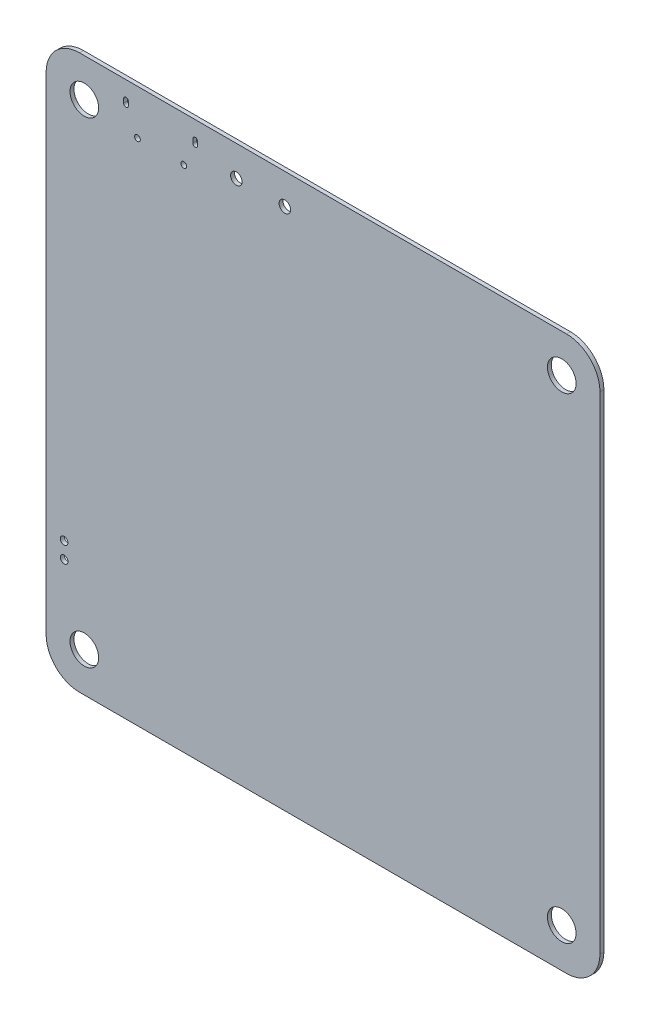
ISO-10303-21;
HEADER;
FILE_DESCRIPTION(('STEP AP214'),'2;1');
FILE_NAME('part.step','',(''),(''),'','','');
FILE_SCHEMA(('AUTOMOTIVE_DESIGN { 1 0 10303 214 1 1 1 1 }'));
ENDSEC;
DATA;
#1=APPLICATION_CONTEXT('core data for automotive mechanical design processes');
#2=APPLICATION_PROTOCOL_DEFINITION('international standard','automotive_design',2000,#1);
#3=PRODUCT_CONTEXT('',#1,'mechanical');
#4=PRODUCT('Part','Part','',(#3));
#5=PRODUCT_RELATED_PRODUCT_CATEGORY('part','',(#4));
#6=PRODUCT_DEFINITION_FORMATION('','',#4);
#7=PRODUCT_DEFINITION_CONTEXT('part definition',#1,'design');
#8=PRODUCT_DEFINITION('design','',#6,#7);
#9=PRODUCT_DEFINITION_SHAPE('','',#8);
#10=(LENGTH_UNIT() NAMED_UNIT(*) SI_UNIT(.MILLI.,.METRE.));
#11=(NAMED_UNIT(*) PLANE_ANGLE_UNIT() SI_UNIT($,.RADIAN.));
#12=(NAMED_UNIT(*) SI_UNIT($,.STERADIAN.) SOLID_ANGLE_UNIT());
#13=UNCERTAINTY_MEASURE_WITH_UNIT(LENGTH_MEASURE(1.E-05),#10,'distance_accuracy_value','');
#14=(GEOMETRIC_REPRESENTATION_CONTEXT(3) GLOBAL_UNCERTAINTY_ASSIGNED_CONTEXT((#13)) GLOBAL_UNIT_ASSIGNED_CONTEXT((#10,
#11,#12)) REPRESENTATION_CONTEXT('',''));
#15=CARTESIAN_POINT('',(0.,0.,0.));
#16=DIRECTION('',(0.,0.,1.));
#17=DIRECTION('',(1.,0.,0.));
#18=AXIS2_PLACEMENT_3D('',#15,#16,#17);
#19=CARTESIAN_POINT('',(152.4200533,92.07949834,0.41148));
#20=DIRECTION('',(0.,0.,-1.));
#21=DIRECTION('',(-1.,0.,0.));
#22=AXIS2_PLACEMENT_3D('',#19,#20,#21);
#23=PLANE('',#22);
#24=CARTESIAN_POINT('',(172.339,143.383,0.41148));
#25=DIRECTION('',(0.,0.,-1.));
#26=DIRECTION('',(-1.,0.,0.));
#27=AXIS2_PLACEMENT_3D('',#24,#25,#26);
#28=CIRCLE('',#27,0.5999988);
#29=CARTESIAN_POINT('',(171.7390012,143.383,0.41148));
#30=VERTEX_POINT('',#29);
#31=EDGE_CURVE('E240',#30,#30,#28,.T.);
#32=ORIENTED_EDGE('',*,*,#31,.T.);
#33=EDGE_LOOP('',(#32));
#34=FACE_BOUND('',#33,.T.);
#35=CARTESIAN_POINT('',(177.419,143.383,0.41148));
#36=DIRECTION('',(0.,0.,-1.));
#37=DIRECTION('',(-1.,0.,0.));
#38=AXIS2_PLACEMENT_3D('',#35,#36,#37);
#39=CIRCLE('',#38,0.5999988);
#40=CARTESIAN_POINT('',(176.8190012,143.383,0.41148));
#41=VERTEX_POINT('',#40);
#42=EDGE_CURVE('E243',#41,#41,#39,.T.);
#43=ORIENTED_EDGE('',*,*,#42,.T.);
#44=EDGE_LOOP('',(#43));
#45=FACE_BOUND('',#44,.T.);
#46=DIRECTION('',(0.,1.,0.));
#47=VECTOR('',#46,1.);
#48=CARTESIAN_POINT('',(167.78199616,144.7259996,0.41148));
#49=LINE('',#48,#47);
#50=CARTESIAN_POINT('',(167.78199616,144.7259996,0.41148));
#51=VERTEX_POINT('',#50);
#52=CARTESIAN_POINT('',(167.78199616,144.3260004,0.41148));
#53=VERTEX_POINT('',#52);
#54=EDGE_CURVE('E157',#51,#53,#49,.F.);
#55=ORIENTED_EDGE('',*,*,#54,.F.);
#56=CARTESIAN_POINT('',(168.03199566,144.7259996,0.41148));
#57=DIRECTION('',(0.,0.,-1.));
#58=DIRECTION('',(-1.,0.,0.));
#59=AXIS2_PLACEMENT_3D('',#56,#57,#58);
#60=CIRCLE('',#59,0.2499995);
#61=CARTESIAN_POINT('',(168.28199516,144.7259996,0.41148));
#62=VERTEX_POINT('',#61);
#63=EDGE_CURVE('E164',#51,#62,#60,.T.);
#64=ORIENTED_EDGE('',*,*,#63,.T.);
#65=DIRECTION('',(0.,1.,0.));
#66=VECTOR('',#65,1.);
#67=CARTESIAN_POINT('',(168.28199516,144.3260004,0.41148));
#68=LINE('',#67,#66);
#69=CARTESIAN_POINT('',(168.28199516,144.3260004,0.41148));
#70=VERTEX_POINT('',#69);
#71=EDGE_CURVE('E161',#70,#62,#68,.T.);
#72=ORIENTED_EDGE('',*,*,#71,.F.);
#73=CARTESIAN_POINT('',(168.03199566,144.3260004,0.41148));
#74=DIRECTION('',(0.,0.,-1.));
#75=DIRECTION('',(-1.,0.,0.));
#76=AXIS2_PLACEMENT_3D('',#73,#74,#75);
#77=CIRCLE('',#76,0.2499995);
#78=EDGE_CURVE('E246',#70,#53,#77,.T.);
#79=ORIENTED_EDGE('',*,*,#78,.T.);
#80=EDGE_LOOP('',(#55,#64,#72,#79));
#81=FACE_BOUND('',#80,.T.);
#82=CARTESIAN_POINT('',(206.42005452,142.57949894,0.41148));
#83=DIRECTION('',(0.,0.,-1.));
#84=DIRECTION('',(-1.,0.,0.));
#85=AXIS2_PLACEMENT_3D('',#82,#83,#84);
#86=CIRCLE('',#85,1.49999954);
#87=CARTESIAN_POINT('',(204.92005498,142.57949894,0.41148));
#88=VERTEX_POINT('',#87);
#89=EDGE_CURVE('E165',#88,#88,#86,.T.);
#90=ORIENTED_EDGE('',*,*,#89,.T.);
#91=EDGE_LOOP('',(#90));
#92=FACE_BOUND('',#91,.T.);
#93=CARTESIAN_POINT('',(206.42005452,92.70903734,0.41148));
#94=DIRECTION('',(0.,0.,-1.));
#95=DIRECTION('',(-1.,0.,0.));
#96=AXIS2_PLACEMENT_3D('',#93,#94,#95);
#97=CIRCLE('',#96,1.49999954);
#98=CARTESIAN_POINT('',(204.92005498,92.70903734,0.41148));
#99=VERTEX_POINT('',#98);
#100=EDGE_CURVE('E252',#99,#99,#97,.T.);
#101=ORIENTED_EDGE('',*,*,#100,.T.);
#102=EDGE_LOOP('',(#101));
#103=FACE_BOUND('',#102,.T.);
#104=CARTESIAN_POINT('',(166.83199552,141.87600022,0.41148));
#105=DIRECTION('',(0.,0.,-1.));
#106=DIRECTION('',(-1.,0.,0.));
#107=AXIS2_PLACEMENT_3D('',#104,#105,#106);
#108=CIRCLE('',#107,0.2999994);
#109=CARTESIAN_POINT('',(166.53199612,141.87600022,0.41148));
#110=VERTEX_POINT('',#109);
#111=EDGE_CURVE('E255',#110,#110,#108,.T.);
#112=ORIENTED_EDGE('',*,*,#111,.T.);
#113=EDGE_LOOP('',(#112));
#114=FACE_BOUND('',#113,.T.);
#115=DIRECTION('',(0.,1.,0.));
#116=VECTOR('',#115,1.);
#117=CARTESIAN_POINT('',(160.53199542,144.7259996,0.41148));
#118=LINE('',#117,#116);
#119=CARTESIAN_POINT('',(160.53199542,144.7259996,0.41148));
#120=VERTEX_POINT('',#119);
#121=CARTESIAN_POINT('',(160.53199542,144.3260004,0.41148));
#122=VERTEX_POINT('',#121);
#123=EDGE_CURVE('E166',#120,#122,#118,.F.);
#124=ORIENTED_EDGE('',*,*,#123,.F.);
#125=CARTESIAN_POINT('',(160.78199492,144.7259996,0.41148));
#126=DIRECTION('',(0.,0.,-1.));
#127=DIRECTION('',(-1.,0.,0.));
#128=AXIS2_PLACEMENT_3D('',#125,#126,#127);
#129=CIRCLE('',#128,0.2499995);
#130=CARTESIAN_POINT('',(161.03199442,144.7259996,0.41148));
#131=VERTEX_POINT('',#130);
#132=EDGE_CURVE('E174',#120,#131,#129,.T.);
#133=ORIENTED_EDGE('',*,*,#132,.T.);
#134=DIRECTION('',(0.,1.,0.));
#135=VECTOR('',#134,1.);
#136=CARTESIAN_POINT('',(161.03199442,144.3260004,0.41148));
#137=LINE('',#136,#135);
#138=CARTESIAN_POINT('',(161.03199442,144.3260004,0.41148));
#139=VERTEX_POINT('',#138);
#140=EDGE_CURVE('E171',#139,#131,#137,.T.);
#141=ORIENTED_EDGE('',*,*,#140,.F.);
#142=CARTESIAN_POINT('',(160.78199492,144.3260004,0.41148));
#143=DIRECTION('',(0.,0.,-1.));
#144=DIRECTION('',(-1.,0.,0.));
#145=AXIS2_PLACEMENT_3D('',#142,#143,#144);
#146=CIRCLE('',#145,0.2499995);
#147=EDGE_CURVE('E259',#139,#122,#146,.T.);
#148=ORIENTED_EDGE('',*,*,#147,.T.);
#149=EDGE_LOOP('',(#124,#133,#141,#148));
#150=FACE_BOUND('',#149,.T.);
#151=CARTESIAN_POINT('',(161.98199506,141.87600022,0.41148));
#152=DIRECTION('',(0.,0.,-1.));
#153=DIRECTION('',(-1.,0.,0.));
#154=AXIS2_PLACEMENT_3D('',#151,#152,#153);
#155=CIRCLE('',#154,0.2999994);
#156=CARTESIAN_POINT('',(161.68199566,141.87600022,0.41148));
#157=VERTEX_POINT('',#156);
#158=EDGE_CURVE('E175',#157,#157,#155,.T.);
#159=ORIENTED_EDGE('',*,*,#158,.T.);
#160=EDGE_LOOP('',(#159));
#161=FACE_BOUND('',#160,.T.);
#162=CARTESIAN_POINT('',(156.42005292,142.57949894,0.41148));
#163=DIRECTION('',(0.,0.,-1.));
#164=DIRECTION('',(-1.,0.,0.));
#165=AXIS2_PLACEMENT_3D('',#162,#163,#164);
#166=CIRCLE('',#165,1.49999954);
#167=CARTESIAN_POINT('',(154.92005338,142.57949894,0.41148));
#168=VERTEX_POINT('',#167);
#169=EDGE_CURVE('E265',#168,#168,#166,.T.);
#170=ORIENTED_EDGE('',*,*,#169,.T.);
#171=EDGE_LOOP('',(#170));
#172=FACE_BOUND('',#171,.T.);
#173=CARTESIAN_POINT('',(154.305,99.822,0.41148));
#174=DIRECTION('',(0.,0.,-1.));
#175=DIRECTION('',(-1.,0.,0.));
#176=AXIS2_PLACEMENT_3D('',#173,#174,#175);
#177=CIRCLE('',#176,0.3999992);
#178=CARTESIAN_POINT('',(153.9050008,99.822,0.41148));
#179=VERTEX_POINT('',#178);
#180=EDGE_CURVE('E268',#179,#179,#177,.T.);
#181=ORIENTED_EDGE('',*,*,#180,.T.);
#182=EDGE_LOOP('',(#181));
#183=FACE_BOUND('',#182,.T.);
#184=CARTESIAN_POINT('',(156.42005292,92.70903734,0.41148));
#185=DIRECTION('',(0.,0.,-1.));
#186=DIRECTION('',(-1.,0.,0.));
#187=AXIS2_PLACEMENT_3D('',#184,#185,#186);
#188=CIRCLE('',#187,1.49999954);
#189=CARTESIAN_POINT('',(154.92005338,92.70903734,0.41148));
#190=VERTEX_POINT('',#189);
#191=EDGE_CURVE('E271',#190,#190,#188,.T.);
#192=ORIENTED_EDGE('',*,*,#191,.T.);
#193=EDGE_LOOP('',(#192));
#194=FACE_BOUND('',#193,.T.);
#195=CARTESIAN_POINT('',(154.305,101.52200168,0.41148));
#196=DIRECTION('',(0.,0.,-1.));
#197=DIRECTION('',(-1.,0.,0.));
#198=AXIS2_PLACEMENT_3D('',#195,#196,#197);
#199=CIRCLE('',#198,0.3999992);
#200=CARTESIAN_POINT('',(153.9050008,101.52200168,0.41148));
#201=VERTEX_POINT('',#200);
#202=EDGE_CURVE('E274',#201,#201,#199,.T.);
#203=ORIENTED_EDGE('',*,*,#202,.T.);
#204=EDGE_LOOP('',(#203));
#205=FACE_BOUND('',#204,.T.);
#206=DIRECTION('',(1.,0.,0.));
#207=VECTOR('',#206,1.);
#208=CARTESIAN_POINT('',(155.92005392,88.57949772,0.41148));
#209=LINE('',#208,#207);
#210=CARTESIAN_POINT('',(155.92005353173,88.5794977199995,0.41148));
#211=VERTEX_POINT('',#210);
#212=CARTESIAN_POINT('',(206.920053908265,88.57949772,0.41148));
#213=VERTEX_POINT('',#212);
#214=EDGE_CURVE('E177',#211,#213,#209,.T.);
#215=ORIENTED_EDGE('',*,*,#214,.T.);
#216=CARTESIAN_POINT('',(206.92005429653,92.079497563468,0.41148));
#217=DIRECTION('',(0.,0.,-1.));
#218=DIRECTION('',(-1.,0.,0.));
#219=AXIS2_PLACEMENT_3D('',#216,#217,#218);
#220=CIRCLE('',#219,3.499999843469);
#221=CARTESIAN_POINT('',(210.420054139999,92.079497951734,0.41148));
#222=VERTEX_POINT('',#221);
#223=EDGE_CURVE('E180',#222,#213,#220,.T.);
#224=ORIENTED_EDGE('',*,*,#223,.F.);
#225=DIRECTION('',(0.,1.,0.));
#226=VECTOR('',#225,1.);
#227=CARTESIAN_POINT('',(210.42005414,92.07949834,0.41148));
#228=LINE('',#227,#226);
#229=CARTESIAN_POINT('',(210.42005414,143.079498328265,0.41148));
#230=VERTEX_POINT('',#229);
#231=EDGE_CURVE('E181',#222,#230,#228,.T.);
#232=ORIENTED_EDGE('',*,*,#231,.T.);
#233=CARTESIAN_POINT('',(206.92005429653,143.07949871653,0.41148));
#234=DIRECTION('',(0.,0.,-1.));
#235=DIRECTION('',(-1.,0.,0.));
#236=AXIS2_PLACEMENT_3D('',#233,#234,#235);
#237=CIRCLE('',#236,3.499999843469);
#238=CARTESIAN_POINT('',(206.920053908265,146.579498559999,0.41148));
#239=VERTEX_POINT('',#238);
#240=EDGE_CURVE('E136',#239,#230,#237,.T.);
#241=ORIENTED_EDGE('',*,*,#240,.F.);
#242=DIRECTION('',(1.,0.,0.));
#243=VECTOR('',#242,1.);
#244=CARTESIAN_POINT('',(206.92005352,146.57949856,0.41148));
#245=LINE('',#244,#243);
#246=CARTESIAN_POINT('',(155.92005353173,146.57949856,0.41148));
#247=VERTEX_POINT('',#246);
#248=EDGE_CURVE('E132',#239,#247,#245,.F.);
#249=ORIENTED_EDGE('',*,*,#248,.T.);
#250=CARTESIAN_POINT('',(155.92005314346,143.07949871653,0.41148));
#251=DIRECTION('',(0.,0.,-1.));
#252=DIRECTION('',(-1.,0.,0.));
#253=AXIS2_PLACEMENT_3D('',#250,#251,#252);
#254=CIRCLE('',#253,3.499999843469);
#255=CARTESIAN_POINT('',(152.420053299995,143.07949871653,0.41148));
#256=VERTEX_POINT('',#255);
#257=EDGE_CURVE('E20',#256,#247,#254,.T.);
#258=ORIENTED_EDGE('',*,*,#257,.F.);
#259=DIRECTION('',(0.,1.,0.));
#260=VECTOR('',#259,1.);
#261=CARTESIAN_POINT('',(152.4200533,143.07949794,0.41148));
#262=LINE('',#261,#260);
#263=CARTESIAN_POINT('',(152.420053299995,92.079497563468,0.41148));
#264=VERTEX_POINT('',#263);
#265=EDGE_CURVE('E127',#256,#264,#262,.F.);
#266=ORIENTED_EDGE('',*,*,#265,.T.);
#267=CARTESIAN_POINT('',(155.92005314346,92.079497563468,0.41148));
#268=DIRECTION('',(0.,0.,-1.));
#269=DIRECTION('',(-1.,0.,0.));
#270=AXIS2_PLACEMENT_3D('',#267,#268,#269);
#271=CIRCLE('',#270,3.499999843469);
#272=EDGE_CURVE('E278',#211,#264,#271,.T.);
#273=ORIENTED_EDGE('',*,*,#272,.F.);
#274=EDGE_LOOP('',(#215,#224,#232,#241,#249,#258,#266,#273));
#275=FACE_BOUND('',#274,.T.);
#276=ADVANCED_FACE('F17',(#34,#45,#81,#92,#103,#114,#150,#161,#172,#183,#194,#205,#275),#23,.F.);
#277=CARTESIAN_POINT('',(152.4200533,143.07949794,0.));
#278=DIRECTION('',(1.,0.,0.));
#279=DIRECTION('',(0.,0.,-1.));
#280=AXIS2_PLACEMENT_3D('',#277,#278,#279);
#281=PLANE('',#280);
#282=DIRECTION('',(0.,0.,-1.));
#283=VECTOR('',#282,1.);
#284=CARTESIAN_POINT('',(152.420053299991,92.079497563468,0.));
#285=LINE('',#284,#283);
#286=CARTESIAN_POINT('',(152.420053299995,92.079497563468,0.));
#287=VERTEX_POINT('',#286);
#288=EDGE_CURVE('E277',#264,#287,#285,.T.);
#289=ORIENTED_EDGE('',*,*,#288,.F.);
#290=ORIENTED_EDGE('',*,*,#265,.F.);
#291=DIRECTION('',(0.,0.,-1.));
#292=VECTOR('',#291,1.);
#293=CARTESIAN_POINT('',(152.420053299991,143.07949871653,0.));
#294=LINE('',#293,#292);
#295=CARTESIAN_POINT('',(152.420053299995,143.07949871653,0.));
#296=VERTEX_POINT('',#295);
#297=EDGE_CURVE('E146',#296,#256,#294,.F.);
#298=ORIENTED_EDGE('',*,*,#297,.F.);
#299=DIRECTION('',(0.,1.,0.));
#300=VECTOR('',#299,1.);
#301=CARTESIAN_POINT('',(152.4200533,92.07949834,0.));
#302=LINE('',#301,#300);
#303=EDGE_CURVE('E239',#287,#296,#302,.T.);
#304=ORIENTED_EDGE('',*,*,#303,.F.);
#305=EDGE_LOOP('',(#289,#290,#298,#304));
#306=FACE_BOUND('',#305,.T.);
#307=ADVANCED_FACE('F575',(#306),#281,.F.);
#308=CARTESIAN_POINT('',(155.92005314346,143.07949871653,0.));
#309=DIRECTION('',(0.,0.,-1.));
#310=DIRECTION('',(-1.,0.,0.));
#311=AXIS2_PLACEMENT_3D('',#308,#309,#310);
#312=CYLINDRICAL_SURFACE('',#311,3.499999843469);
#313=ORIENTED_EDGE('',*,*,#257,.T.);
#314=DIRECTION('',(0.,0.,-1.));
#315=VECTOR('',#314,1.);
#316=CARTESIAN_POINT('',(155.92005392,146.57949856,0.));
#317=LINE('',#316,#315);
#318=CARTESIAN_POINT('',(155.92005353173,146.57949856,0.));
#319=VERTEX_POINT('',#318);
#320=EDGE_CURVE('E140',#247,#319,#317,.T.);
#321=ORIENTED_EDGE('',*,*,#320,.T.);
#322=CARTESIAN_POINT('',(155.92005314346,143.07949871653,0.));
#323=DIRECTION('',(0.,0.,-1.));
#324=DIRECTION('',(-1.,0.,0.));
#325=AXIS2_PLACEMENT_3D('',#322,#323,#324);
#326=CIRCLE('',#325,3.499999843469);
#327=EDGE_CURVE('E237',#296,#319,#326,.T.);
#328=ORIENTED_EDGE('',*,*,#327,.F.);
#329=ORIENTED_EDGE('',*,*,#297,.T.);
#330=EDGE_LOOP('',(#313,#321,#328,#329));
#331=FACE_BOUND('',#330,.T.);
#332=ADVANCED_FACE('F143',(#331),#312,.T.);
#333=CARTESIAN_POINT('',(206.92005352,146.57949856,0.));
#334=DIRECTION('',(0.,-1.,0.));
#335=DIRECTION('',(0.,0.,-1.));
#336=AXIS2_PLACEMENT_3D('',#333,#334,#335);
#337=PLANE('',#336);
#338=ORIENTED_EDGE('',*,*,#320,.F.);
#339=ORIENTED_EDGE('',*,*,#248,.F.);
#340=DIRECTION('',(0.,0.,-1.));
#341=VECTOR('',#340,1.);
#342=CARTESIAN_POINT('',(206.92005352,146.579498559999,0.));
#343=LINE('',#342,#341);
#344=CARTESIAN_POINT('',(206.920053908265,146.579498559999,0.));
#345=VERTEX_POINT('',#344);
#346=EDGE_CURVE('E151',#345,#239,#343,.F.);
#347=ORIENTED_EDGE('',*,*,#346,.F.);
#348=DIRECTION('',(-1.,0.,0.));
#349=VECTOR('',#348,1.);
#350=CARTESIAN_POINT('',(152.4200533,146.57949856,0.));
#351=LINE('',#350,#349);
#352=EDGE_CURVE('E149',#319,#345,#351,.F.);
#353=ORIENTED_EDGE('',*,*,#352,.F.);
#354=EDGE_LOOP('',(#338,#339,#347,#353));
#355=FACE_BOUND('',#354,.T.);
#356=ADVANCED_FACE('F147',(#355),#337,.F.);
#357=CARTESIAN_POINT('',(206.92005429653,143.07949871653,0.));
#358=DIRECTION('',(0.,0.,-1.));
#359=DIRECTION('',(-1.,0.,0.));
#360=AXIS2_PLACEMENT_3D('',#357,#358,#359);
#361=CYLINDRICAL_SURFACE('',#360,3.499999843469);
#362=ORIENTED_EDGE('',*,*,#240,.T.);
#363=DIRECTION('',(0.,0.,1.));
#364=VECTOR('',#363,1.);
#365=CARTESIAN_POINT('',(210.42005414,143.07949794,0.));
#366=LINE('',#365,#364);
#367=CARTESIAN_POINT('',(210.42005414,143.079498328265,0.));
#368=VERTEX_POINT('',#367);
#369=EDGE_CURVE('E182',#230,#368,#366,.F.);
#370=ORIENTED_EDGE('',*,*,#369,.T.);
#371=CARTESIAN_POINT('',(206.92005429653,143.07949871653,0.));
#372=DIRECTION('',(0.,0.,-1.));
#373=DIRECTION('',(-1.,0.,0.));
#374=AXIS2_PLACEMENT_3D('',#371,#372,#373);
#375=CIRCLE('',#374,3.499999843469);
#376=EDGE_CURVE('E234',#345,#368,#375,.T.);
#377=ORIENTED_EDGE('',*,*,#376,.F.);
#378=ORIENTED_EDGE('',*,*,#346,.T.);
#379=EDGE_LOOP('',(#362,#370,#377,#378));
#380=FACE_BOUND('',#379,.T.);
#381=ADVANCED_FACE('F286',(#380),#361,.T.);
#382=CARTESIAN_POINT('',(210.42005414,92.07949834,0.));
#383=DIRECTION('',(-1.,0.,0.));
#384=DIRECTION('',(0.,0.,1.));
#385=AXIS2_PLACEMENT_3D('',#382,#383,#384);
#386=PLANE('',#385);
#387=ORIENTED_EDGE('',*,*,#369,.F.);
#388=ORIENTED_EDGE('',*,*,#231,.F.);
#389=DIRECTION('',(0.,0.,-1.));
#390=VECTOR('',#389,1.);
#391=CARTESIAN_POINT('',(210.420054139999,92.07949834,0.));
#392=LINE('',#391,#390);
#393=CARTESIAN_POINT('',(210.420054139999,92.079497951734,0.));
#394=VERTEX_POINT('',#393);
#395=EDGE_CURVE('E283',#394,#222,#392,.F.);
#396=ORIENTED_EDGE('',*,*,#395,.F.);
#397=DIRECTION('',(0.,1.,0.));
#398=VECTOR('',#397,1.);
#399=CARTESIAN_POINT('',(210.42005414,92.07949834,0.));
#400=LINE('',#399,#398);
#401=EDGE_CURVE('E233',#368,#394,#400,.F.);
#402=ORIENTED_EDGE('',*,*,#401,.F.);
#403=EDGE_LOOP('',(#387,#388,#396,#402));
#404=FACE_BOUND('',#403,.T.);
#405=ADVANCED_FACE('F290',(#404),#386,.F.);
#406=CARTESIAN_POINT('',(206.92005429653,92.079497563468,0.));
#407=DIRECTION('',(0.,0.,-1.));
#408=DIRECTION('',(-1.,0.,0.));
#409=AXIS2_PLACEMENT_3D('',#406,#407,#408);
#410=CYLINDRICAL_SURFACE('',#409,3.499999843469);
#411=ORIENTED_EDGE('',*,*,#223,.T.);
#412=DIRECTION('',(0.,0.,1.));
#413=VECTOR('',#412,1.);
#414=CARTESIAN_POINT('',(206.92005352,88.57949772,0.));
#415=LINE('',#414,#413);
#416=CARTESIAN_POINT('',(206.920053908265,88.57949772,0.));
#417=VERTEX_POINT('',#416);
#418=EDGE_CURVE('E179',#213,#417,#415,.F.);
#419=ORIENTED_EDGE('',*,*,#418,.T.);
#420=CARTESIAN_POINT('',(206.92005429653,92.079497563468,0.));
#421=DIRECTION('',(0.,0.,-1.));
#422=DIRECTION('',(-1.,0.,0.));
#423=AXIS2_PLACEMENT_3D('',#420,#421,#422);
#424=CIRCLE('',#423,3.499999843469);
#425=EDGE_CURVE('E230',#394,#417,#424,.T.);
#426=ORIENTED_EDGE('',*,*,#425,.F.);
#427=ORIENTED_EDGE('',*,*,#395,.T.);
#428=EDGE_LOOP('',(#411,#419,#426,#427));
#429=FACE_BOUND('',#428,.T.);
#430=ADVANCED_FACE('F537',(#429),#410,.T.);
#431=CARTESIAN_POINT('',(155.92005392,88.57949772,0.));
#432=DIRECTION('',(0.,1.,0.));
#433=DIRECTION('',(0.,0.,1.));
#434=AXIS2_PLACEMENT_3D('',#431,#432,#433);
#435=PLANE('',#434);
#436=ORIENTED_EDGE('',*,*,#418,.F.);
#437=ORIENTED_EDGE('',*,*,#214,.F.);
#438=DIRECTION('',(0.,0.,-1.));
#439=VECTOR('',#438,1.);
#440=CARTESIAN_POINT('',(155.92005392,88.5794977199991,0.));
#441=LINE('',#440,#439);
#442=CARTESIAN_POINT('',(155.92005353173,88.5794977199995,0.));
#443=VERTEX_POINT('',#442);
#444=EDGE_CURVE('E281',#443,#211,#441,.F.);
#445=ORIENTED_EDGE('',*,*,#444,.F.);
#446=DIRECTION('',(-1.,0.,0.));
#447=VECTOR('',#446,1.);
#448=CARTESIAN_POINT('',(152.4200533,88.57949772,0.));
#449=LINE('',#448,#447);
#450=EDGE_CURVE('E229',#417,#443,#449,.T.);
#451=ORIENTED_EDGE('',*,*,#450,.F.);
#452=EDGE_LOOP('',(#436,#437,#445,#451));
#453=FACE_BOUND('',#452,.T.);
#454=ADVANCED_FACE('F528',(#453),#435,.F.);
#455=CARTESIAN_POINT('',(155.92005314346,92.079497563468,0.));
#456=DIRECTION('',(0.,0.,-1.));
#457=DIRECTION('',(-1.,0.,0.));
#458=AXIS2_PLACEMENT_3D('',#455,#456,#457);
#459=CYLINDRICAL_SURFACE('',#458,3.499999843469);
#460=ORIENTED_EDGE('',*,*,#272,.T.);
#461=ORIENTED_EDGE('',*,*,#288,.T.);
#462=CARTESIAN_POINT('',(155.92005314346,92.079497563468,0.));
#463=DIRECTION('',(0.,0.,-1.));
#464=DIRECTION('',(-1.,0.,0.));
#465=AXIS2_PLACEMENT_3D('',#462,#463,#464);
#466=CIRCLE('',#465,3.499999843469);
#467=EDGE_CURVE('E226',#443,#287,#466,.T.);
#468=ORIENTED_EDGE('',*,*,#467,.F.);
#469=ORIENTED_EDGE('',*,*,#444,.T.);
#470=EDGE_LOOP('',(#460,#461,#468,#469));
#471=FACE_BOUND('',#470,.T.);
#472=ADVANCED_FACE('F519',(#471),#459,.T.);
#473=CARTESIAN_POINT('',(154.305,101.52200168,0.));
#474=DIRECTION('',(0.,0.,-1.));
#475=DIRECTION('',(-1.,0.,0.));
#476=AXIS2_PLACEMENT_3D('',#473,#474,#475);
#477=CYLINDRICAL_SURFACE('',#476,0.3999992);
#478=ORIENTED_EDGE('',*,*,#202,.F.);
#479=EDGE_LOOP('',(#478));
#480=FACE_BOUND('',#479,.T.);
#481=CARTESIAN_POINT('',(154.305,101.52200168,0.));
#482=DIRECTION('',(0.,0.,-1.));
#483=DIRECTION('',(-1.,0.,0.));
#484=AXIS2_PLACEMENT_3D('',#481,#482,#483);
#485=CIRCLE('',#484,0.3999992);
#486=CARTESIAN_POINT('',(153.9050008,101.52200168,0.));
#487=VERTEX_POINT('',#486);
#488=EDGE_CURVE('E223',#487,#487,#485,.F.);
#489=ORIENTED_EDGE('',*,*,#488,.F.);
#490=EDGE_LOOP('',(#489));
#491=FACE_BOUND('',#490,.T.);
#492=ADVANCED_FACE('F510',(#480,#491),#477,.F.);
#493=CARTESIAN_POINT('',(156.42005292,92.70903734,0.));
#494=DIRECTION('',(0.,0.,-1.));
#495=DIRECTION('',(-1.,0.,0.));
#496=AXIS2_PLACEMENT_3D('',#493,#494,#495);
#497=CYLINDRICAL_SURFACE('',#496,1.49999954);
#498=ORIENTED_EDGE('',*,*,#191,.F.);
#499=EDGE_LOOP('',(#498));
#500=FACE_BOUND('',#499,.T.);
#501=CARTESIAN_POINT('',(156.42005292,92.70903734,0.));
#502=DIRECTION('',(0.,0.,-1.));
#503=DIRECTION('',(-1.,0.,0.));
#504=AXIS2_PLACEMENT_3D('',#501,#502,#503);
#505=CIRCLE('',#504,1.49999954);
#506=CARTESIAN_POINT('',(154.92005338,92.70903734,0.));
#507=VERTEX_POINT('',#506);
#508=EDGE_CURVE('E220',#507,#507,#505,.F.);
#509=ORIENTED_EDGE('',*,*,#508,.F.);
#510=EDGE_LOOP('',(#509));
#511=FACE_BOUND('',#510,.T.);
#512=ADVANCED_FACE('F501',(#500,#511),#497,.F.);
#513=CARTESIAN_POINT('',(154.305,99.822,0.));
#514=DIRECTION('',(0.,0.,-1.));
#515=DIRECTION('',(-1.,0.,0.));
#516=AXIS2_PLACEMENT_3D('',#513,#514,#515);
#517=CYLINDRICAL_SURFACE('',#516,0.3999992);
#518=ORIENTED_EDGE('',*,*,#180,.F.);
#519=EDGE_LOOP('',(#518));
#520=FACE_BOUND('',#519,.T.);
#521=CARTESIAN_POINT('',(154.305,99.822,0.));
#522=DIRECTION('',(0.,0.,-1.));
#523=DIRECTION('',(-1.,0.,0.));
#524=AXIS2_PLACEMENT_3D('',#521,#522,#523);
#525=CIRCLE('',#524,0.3999992);
#526=CARTESIAN_POINT('',(153.9050008,99.822,0.));
#527=VERTEX_POINT('',#526);
#528=EDGE_CURVE('E217',#527,#527,#525,.F.);
#529=ORIENTED_EDGE('',*,*,#528,.F.);
#530=EDGE_LOOP('',(#529));
#531=FACE_BOUND('',#530,.T.);
#532=ADVANCED_FACE('F492',(#520,#531),#517,.F.);
#533=CARTESIAN_POINT('',(156.42005292,142.57949894,0.));
#534=DIRECTION('',(0.,0.,-1.));
#535=DIRECTION('',(-1.,0.,0.));
#536=AXIS2_PLACEMENT_3D('',#533,#534,#535);
#537=CYLINDRICAL_SURFACE('',#536,1.49999954);
#538=ORIENTED_EDGE('',*,*,#169,.F.);
#539=EDGE_LOOP('',(#538));
#540=FACE_BOUND('',#539,.T.);
#541=CARTESIAN_POINT('',(156.42005292,142.57949894,0.));
#542=DIRECTION('',(0.,0.,-1.));
#543=DIRECTION('',(-1.,0.,0.));
#544=AXIS2_PLACEMENT_3D('',#541,#542,#543);
#545=CIRCLE('',#544,1.49999954);
#546=CARTESIAN_POINT('',(154.92005338,142.57949894,0.));
#547=VERTEX_POINT('',#546);
#548=EDGE_CURVE('E214',#547,#547,#545,.F.);
#549=ORIENTED_EDGE('',*,*,#548,.F.);
#550=EDGE_LOOP('',(#549));
#551=FACE_BOUND('',#550,.T.);
#552=ADVANCED_FACE('F483',(#540,#551),#537,.F.);
#553=CARTESIAN_POINT('',(161.98199506,141.87600022,0.));
#554=DIRECTION('',(0.,0.,-1.));
#555=DIRECTION('',(-1.,0.,0.));
#556=AXIS2_PLACEMENT_3D('',#553,#554,#555);
#557=CYLINDRICAL_SURFACE('',#556,0.2999994);
#558=ORIENTED_EDGE('',*,*,#158,.F.);
#559=EDGE_LOOP('',(#558));
#560=FACE_BOUND('',#559,.T.);
#561=CARTESIAN_POINT('',(161.98199506,141.87600022,0.));
#562=DIRECTION('',(0.,0.,-1.));
#563=DIRECTION('',(-1.,0.,0.));
#564=AXIS2_PLACEMENT_3D('',#561,#562,#563);
#565=CIRCLE('',#564,0.2999994);
#566=CARTESIAN_POINT('',(161.68199566,141.87600022,0.));
#567=VERTEX_POINT('',#566);
#568=EDGE_CURVE('E211',#567,#567,#565,.F.);
#569=ORIENTED_EDGE('',*,*,#568,.F.);
#570=EDGE_LOOP('',(#569));
#571=FACE_BOUND('',#570,.T.);
#572=ADVANCED_FACE('F474',(#560,#571),#557,.F.);
#573=CARTESIAN_POINT('',(161.03199442,144.3260004,0.));
#574=DIRECTION('',(-1.,0.,0.));
#575=DIRECTION('',(0.,0.,1.));
#576=AXIS2_PLACEMENT_3D('',#573,#574,#575);
#577=PLANE('',#576);
#578=DIRECTION('',(0.,0.,-1.));
#579=VECTOR('',#578,1.);
#580=CARTESIAN_POINT('',(161.03199442,144.7259996,0.));
#581=LINE('',#580,#579);
#582=CARTESIAN_POINT('',(161.03199442,144.7259996,0.));
#583=VERTEX_POINT('',#582);
#584=EDGE_CURVE('E262',#131,#583,#581,.T.);
#585=ORIENTED_EDGE('',*,*,#584,.T.);
#586=DIRECTION('',(0.,1.,0.));
#587=VECTOR('',#586,1.);
#588=CARTESIAN_POINT('',(161.03199442,92.07949834,0.));
#589=LINE('',#588,#587);
#590=CARTESIAN_POINT('',(161.03199442,144.3260004,0.));
#591=VERTEX_POINT('',#590);
#592=EDGE_CURVE('E210',#591,#583,#589,.T.);
#593=ORIENTED_EDGE('',*,*,#592,.F.);
#594=DIRECTION('',(0.,0.,-1.));
#595=VECTOR('',#594,1.);
#596=CARTESIAN_POINT('',(161.03199442,144.3260004,0.));
#597=LINE('',#596,#595);
#598=EDGE_CURVE('E169',#591,#139,#597,.F.);
#599=ORIENTED_EDGE('',*,*,#598,.T.);
#600=ORIENTED_EDGE('',*,*,#140,.T.);
#601=EDGE_LOOP('',(#585,#593,#599,#600));
#602=FACE_BOUND('',#601,.T.);
#603=ADVANCED_FACE('F465',(#602),#577,.T.);
#604=CARTESIAN_POINT('',(160.78199492,144.7259996,0.));
#605=DIRECTION('',(0.,0.,-1.));
#606=DIRECTION('',(-1.,0.,0.));
#607=AXIS2_PLACEMENT_3D('',#604,#605,#606);
#608=CYLINDRICAL_SURFACE('',#607,0.2499995);
#609=ORIENTED_EDGE('',*,*,#132,.F.);
#610=DIRECTION('',(0.,0.,-1.));
#611=VECTOR('',#610,1.);
#612=CARTESIAN_POINT('',(160.53199542,144.7259996,0.));
#613=LINE('',#612,#611);
#614=CARTESIAN_POINT('',(160.53199542,144.7259996,0.));
#615=VERTEX_POINT('',#614);
#616=EDGE_CURVE('E170',#615,#120,#613,.F.);
#617=ORIENTED_EDGE('',*,*,#616,.F.);
#618=CARTESIAN_POINT('',(160.78199492,144.7259996,0.));
#619=DIRECTION('',(0.,0.,-1.));
#620=DIRECTION('',(-1.,0.,0.));
#621=AXIS2_PLACEMENT_3D('',#618,#619,#620);
#622=CIRCLE('',#621,0.2499995);
#623=EDGE_CURVE('E207',#583,#615,#622,.F.);
#624=ORIENTED_EDGE('',*,*,#623,.F.);
#625=ORIENTED_EDGE('',*,*,#584,.F.);
#626=EDGE_LOOP('',(#609,#617,#624,#625));
#627=FACE_BOUND('',#626,.T.);
#628=ADVANCED_FACE('F456',(#627),#608,.F.);
#629=CARTESIAN_POINT('',(160.53199542,144.7259996,0.));
#630=DIRECTION('',(1.,0.,0.));
#631=DIRECTION('',(0.,0.,-1.));
#632=AXIS2_PLACEMENT_3D('',#629,#630,#631);
#633=PLANE('',#632);
#634=DIRECTION('',(0.,0.,-1.));
#635=VECTOR('',#634,1.);
#636=CARTESIAN_POINT('',(160.53199542,144.3260004,0.));
#637=LINE('',#636,#635);
#638=CARTESIAN_POINT('',(160.53199542,144.3260004,0.));
#639=VERTEX_POINT('',#638);
#640=EDGE_CURVE('E258',#122,#639,#637,.T.);
#641=ORIENTED_EDGE('',*,*,#640,.T.);
#642=DIRECTION('',(0.,1.,0.));
#643=VECTOR('',#642,1.);
#644=CARTESIAN_POINT('',(160.53199542,92.07949834,0.));
#645=LINE('',#644,#643);
#646=EDGE_CURVE('E206',#615,#639,#645,.F.);
#647=ORIENTED_EDGE('',*,*,#646,.F.);
#648=ORIENTED_EDGE('',*,*,#616,.T.);
#649=ORIENTED_EDGE('',*,*,#123,.T.);
#650=EDGE_LOOP('',(#641,#647,#648,#649));
#651=FACE_BOUND('',#650,.T.);
#652=ADVANCED_FACE('F447',(#651),#633,.T.);
#653=CARTESIAN_POINT('',(160.78199492,144.3260004,0.));
#654=DIRECTION('',(0.,0.,-1.));
#655=DIRECTION('',(-1.,0.,0.));
#656=AXIS2_PLACEMENT_3D('',#653,#654,#655);
#657=CYLINDRICAL_SURFACE('',#656,0.2499995);
#658=ORIENTED_EDGE('',*,*,#147,.F.);
#659=ORIENTED_EDGE('',*,*,#598,.F.);
#660=CARTESIAN_POINT('',(160.78199492,144.3260004,0.));
#661=DIRECTION('',(0.,0.,-1.));
#662=DIRECTION('',(-1.,0.,0.));
#663=AXIS2_PLACEMENT_3D('',#660,#661,#662);
#664=CIRCLE('',#663,0.2499995);
#665=EDGE_CURVE('E203',#639,#591,#664,.F.);
#666=ORIENTED_EDGE('',*,*,#665,.F.);
#667=ORIENTED_EDGE('',*,*,#640,.F.);
#668=EDGE_LOOP('',(#658,#659,#666,#667));
#669=FACE_BOUND('',#668,.T.);
#670=ADVANCED_FACE('F438',(#669),#657,.F.);
#671=CARTESIAN_POINT('',(166.83199552,141.87600022,0.));
#672=DIRECTION('',(0.,0.,-1.));
#673=DIRECTION('',(-1.,0.,0.));
#674=AXIS2_PLACEMENT_3D('',#671,#672,#673);
#675=CYLINDRICAL_SURFACE('',#674,0.2999994);
#676=ORIENTED_EDGE('',*,*,#111,.F.);
#677=EDGE_LOOP('',(#676));
#678=FACE_BOUND('',#677,.T.);
#679=CARTESIAN_POINT('',(166.83199552,141.87600022,0.));
#680=DIRECTION('',(0.,0.,-1.));
#681=DIRECTION('',(-1.,0.,0.));
#682=AXIS2_PLACEMENT_3D('',#679,#680,#681);
#683=CIRCLE('',#682,0.2999994);
#684=CARTESIAN_POINT('',(166.53199612,141.87600022,0.));
#685=VERTEX_POINT('',#684);
#686=EDGE_CURVE('E200',#685,#685,#683,.F.);
#687=ORIENTED_EDGE('',*,*,#686,.F.);
#688=EDGE_LOOP('',(#687));
#689=FACE_BOUND('',#688,.T.);
#690=ADVANCED_FACE('F429',(#678,#689),#675,.F.);
#691=CARTESIAN_POINT('',(206.42005452,92.70903734,0.));
#692=DIRECTION('',(0.,0.,-1.));
#693=DIRECTION('',(-1.,0.,0.));
#694=AXIS2_PLACEMENT_3D('',#691,#692,#693);
#695=CYLINDRICAL_SURFACE('',#694,1.49999954);
#696=ORIENTED_EDGE('',*,*,#100,.F.);
#697=EDGE_LOOP('',(#696));
#698=FACE_BOUND('',#697,.T.);
#699=CARTESIAN_POINT('',(206.42005452,92.70903734,0.));
#700=DIRECTION('',(0.,0.,-1.));
#701=DIRECTION('',(-1.,0.,0.));
#702=AXIS2_PLACEMENT_3D('',#699,#700,#701);
#703=CIRCLE('',#702,1.49999954);
#704=CARTESIAN_POINT('',(204.92005498,92.70903734,0.));
#705=VERTEX_POINT('',#704);
#706=EDGE_CURVE('E197',#705,#705,#703,.F.);
#707=ORIENTED_EDGE('',*,*,#706,.F.);
#708=EDGE_LOOP('',(#707));
#709=FACE_BOUND('',#708,.T.);
#710=ADVANCED_FACE('F352',(#698,#709),#695,.F.);
#711=CARTESIAN_POINT('',(206.42005452,142.57949894,0.));
#712=DIRECTION('',(0.,0.,-1.));
#713=DIRECTION('',(-1.,0.,0.));
#714=AXIS2_PLACEMENT_3D('',#711,#712,#713);
#715=CYLINDRICAL_SURFACE('',#714,1.49999954);
#716=ORIENTED_EDGE('',*,*,#89,.F.);
#717=EDGE_LOOP('',(#716));
#718=FACE_BOUND('',#717,.T.);
#719=CARTESIAN_POINT('',(206.42005452,142.57949894,0.));
#720=DIRECTION('',(0.,0.,-1.));
#721=DIRECTION('',(-1.,0.,0.));
#722=AXIS2_PLACEMENT_3D('',#719,#720,#721);
#723=CIRCLE('',#722,1.49999954);
#724=CARTESIAN_POINT('',(204.92005498,142.57949894,0.));
#725=VERTEX_POINT('',#724);
#726=EDGE_CURVE('E194',#725,#725,#723,.F.);
#727=ORIENTED_EDGE('',*,*,#726,.F.);
#728=EDGE_LOOP('',(#727));
#729=FACE_BOUND('',#728,.T.);
#730=ADVANCED_FACE('F344',(#718,#729),#715,.F.);
#731=CARTESIAN_POINT('',(168.28199516,144.3260004,0.));
#732=DIRECTION('',(-1.,0.,0.));
#733=DIRECTION('',(0.,0.,1.));
#734=AXIS2_PLACEMENT_3D('',#731,#732,#733);
#735=PLANE('',#734);
#736=DIRECTION('',(0.,0.,-1.));
#737=VECTOR('',#736,1.);
#738=CARTESIAN_POINT('',(168.28199516,144.7259996,0.));
#739=LINE('',#738,#737);
#740=CARTESIAN_POINT('',(168.28199516,144.7259996,0.));
#741=VERTEX_POINT('',#740);
#742=EDGE_CURVE('E249',#62,#741,#739,.T.);
#743=ORIENTED_EDGE('',*,*,#742,.T.);
#744=DIRECTION('',(0.,1.,0.));
#745=VECTOR('',#744,1.);
#746=CARTESIAN_POINT('',(168.28199516,92.07949834,0.));
#747=LINE('',#746,#745);
#748=CARTESIAN_POINT('',(168.28199516,144.3260004,0.));
#749=VERTEX_POINT('',#748);
#750=EDGE_CURVE('E193',#749,#741,#747,.T.);
#751=ORIENTED_EDGE('',*,*,#750,.F.);
#752=DIRECTION('',(0.,0.,-1.));
#753=VECTOR('',#752,1.);
#754=CARTESIAN_POINT('',(168.28199516,144.3260004,0.));
#755=LINE('',#754,#753);
#756=EDGE_CURVE('E159',#749,#70,#755,.F.);
#757=ORIENTED_EDGE('',*,*,#756,.T.);
#758=ORIENTED_EDGE('',*,*,#71,.T.);
#759=EDGE_LOOP('',(#743,#751,#757,#758));
#760=FACE_BOUND('',#759,.T.);
#761=ADVANCED_FACE('F342',(#760),#735,.T.);
#762=CARTESIAN_POINT('',(168.03199566,144.7259996,0.));
#763=DIRECTION('',(0.,0.,-1.));
#764=DIRECTION('',(-1.,0.,0.));
#765=AXIS2_PLACEMENT_3D('',#762,#763,#764);
#766=CYLINDRICAL_SURFACE('',#765,0.2499995);
#767=ORIENTED_EDGE('',*,*,#63,.F.);
#768=DIRECTION('',(0.,0.,-1.));
#769=VECTOR('',#768,1.);
#770=CARTESIAN_POINT('',(167.78199616,144.7259996,0.));
#771=LINE('',#770,#769);
#772=CARTESIAN_POINT('',(167.78199616,144.7259996,0.));
#773=VERTEX_POINT('',#772);
#774=EDGE_CURVE('E160',#773,#51,#771,.F.);
#775=ORIENTED_EDGE('',*,*,#774,.F.);
#776=CARTESIAN_POINT('',(168.03199566,144.7259996,0.));
#777=DIRECTION('',(0.,0.,-1.));
#778=DIRECTION('',(-1.,0.,0.));
#779=AXIS2_PLACEMENT_3D('',#776,#777,#778);
#780=CIRCLE('',#779,0.2499995);
#781=EDGE_CURVE('E190',#741,#773,#780,.F.);
#782=ORIENTED_EDGE('',*,*,#781,.F.);
#783=ORIENTED_EDGE('',*,*,#742,.F.);
#784=EDGE_LOOP('',(#767,#775,#782,#783));
#785=FACE_BOUND('',#784,.T.);
#786=ADVANCED_FACE('F333',(#785),#766,.F.);
#787=CARTESIAN_POINT('',(167.78199616,144.7259996,0.));
#788=DIRECTION('',(1.,0.,0.));
#789=DIRECTION('',(0.,0.,-1.));
#790=AXIS2_PLACEMENT_3D('',#787,#788,#789);
#791=PLANE('',#790);
#792=DIRECTION('',(0.,0.,-1.));
#793=VECTOR('',#792,1.);
#794=CARTESIAN_POINT('',(167.78199616,144.3260004,0.));
#795=LINE('',#794,#793);
#796=CARTESIAN_POINT('',(167.78199616,144.3260004,0.));
#797=VERTEX_POINT('',#796);
#798=EDGE_CURVE('E35',#53,#797,#795,.T.);
#799=ORIENTED_EDGE('',*,*,#798,.T.);
#800=DIRECTION('',(0.,1.,0.));
#801=VECTOR('',#800,1.);
#802=CARTESIAN_POINT('',(167.78199616,92.07949834,0.));
#803=LINE('',#802,#801);
#804=EDGE_CURVE('E189',#773,#797,#803,.F.);
#805=ORIENTED_EDGE('',*,*,#804,.F.);
#806=ORIENTED_EDGE('',*,*,#774,.T.);
#807=ORIENTED_EDGE('',*,*,#54,.T.);
#808=EDGE_LOOP('',(#799,#805,#806,#807));
#809=FACE_BOUND('',#808,.T.);
#810=ADVANCED_FACE('F330',(#809),#791,.T.);
#811=CARTESIAN_POINT('',(168.03199566,144.3260004,0.));
#812=DIRECTION('',(0.,0.,-1.));
#813=DIRECTION('',(-1.,0.,0.));
#814=AXIS2_PLACEMENT_3D('',#811,#812,#813);
#815=CYLINDRICAL_SURFACE('',#814,0.2499995);
#816=ORIENTED_EDGE('',*,*,#78,.F.);
#817=ORIENTED_EDGE('',*,*,#756,.F.);
#818=CARTESIAN_POINT('',(168.03199566,144.3260004,0.));
#819=DIRECTION('',(0.,0.,-1.));
#820=DIRECTION('',(-1.,0.,0.));
#821=AXIS2_PLACEMENT_3D('',#818,#819,#820);
#822=CIRCLE('',#821,0.2499995);
#823=EDGE_CURVE('E186',#797,#749,#822,.F.);
#824=ORIENTED_EDGE('',*,*,#823,.F.);
#825=ORIENTED_EDGE('',*,*,#798,.F.);
#826=EDGE_LOOP('',(#816,#817,#824,#825));
#827=FACE_BOUND('',#826,.T.);
#828=ADVANCED_FACE('F340',(#827),#815,.F.);
#829=CARTESIAN_POINT('',(177.419,143.383,0.));
#830=DIRECTION('',(0.,0.,-1.));
#831=DIRECTION('',(-1.,0.,0.));
#832=AXIS2_PLACEMENT_3D('',#829,#830,#831);
#833=CYLINDRICAL_SURFACE('',#832,0.5999988);
#834=ORIENTED_EDGE('',*,*,#42,.F.);
#835=EDGE_LOOP('',(#834));
#836=FACE_BOUND('',#835,.T.);
#837=CARTESIAN_POINT('',(177.419,143.383,0.));
#838=DIRECTION('',(0.,0.,-1.));
#839=DIRECTION('',(-1.,0.,0.));
#840=AXIS2_PLACEMENT_3D('',#837,#838,#839);
#841=CIRCLE('',#840,0.5999988);
#842=CARTESIAN_POINT('',(176.8190012,143.383,0.));
#843=VERTEX_POINT('',#842);
#844=EDGE_CURVE('E26',#843,#843,#841,.F.);
#845=ORIENTED_EDGE('',*,*,#844,.F.);
#846=EDGE_LOOP('',(#845));
#847=FACE_BOUND('',#846,.T.);
#848=ADVANCED_FACE('F362',(#836,#847),#833,.F.);
#849=CARTESIAN_POINT('',(172.339,143.383,0.));
#850=DIRECTION('',(0.,0.,-1.));
#851=DIRECTION('',(-1.,0.,0.));
#852=AXIS2_PLACEMENT_3D('',#849,#850,#851);
#853=CYLINDRICAL_SURFACE('',#852,0.5999988);
#854=ORIENTED_EDGE('',*,*,#31,.F.);
#855=EDGE_LOOP('',(#854));
#856=FACE_BOUND('',#855,.T.);
#857=CARTESIAN_POINT('',(172.339,143.383,0.));
#858=DIRECTION('',(0.,0.,-1.));
#859=DIRECTION('',(-1.,0.,0.));
#860=AXIS2_PLACEMENT_3D('',#857,#858,#859);
#861=CIRCLE('',#860,0.5999988);
#862=CARTESIAN_POINT('',(171.7390012,143.383,0.));
#863=VERTEX_POINT('',#862);
#864=EDGE_CURVE('E11',#863,#863,#861,.F.);
#865=ORIENTED_EDGE('',*,*,#864,.F.);
#866=EDGE_LOOP('',(#865));
#867=FACE_BOUND('',#866,.T.);
#868=ADVANCED_FACE('F356',(#856,#867),#853,.F.);
#869=CARTESIAN_POINT('',(152.4200533,92.07949834,0.));
#870=DIRECTION('',(0.,0.,-1.));
#871=DIRECTION('',(-1.,0.,0.));
#872=AXIS2_PLACEMENT_3D('',#869,#870,#871);
#873=PLANE('',#872);
#874=ORIENTED_EDGE('',*,*,#864,.T.);
#875=EDGE_LOOP('',(#874));
#876=FACE_BOUND('',#875,.T.);
#877=ORIENTED_EDGE('',*,*,#844,.T.);
#878=EDGE_LOOP('',(#877));
#879=FACE_BOUND('',#878,.T.);
#880=ORIENTED_EDGE('',*,*,#804,.T.);
#881=ORIENTED_EDGE('',*,*,#823,.T.);
#882=ORIENTED_EDGE('',*,*,#750,.T.);
#883=ORIENTED_EDGE('',*,*,#781,.T.);
#884=EDGE_LOOP('',(#880,#881,#882,#883));
#885=FACE_BOUND('',#884,.T.);
#886=ORIENTED_EDGE('',*,*,#726,.T.);
#887=EDGE_LOOP('',(#886));
#888=FACE_BOUND('',#887,.T.);
#889=ORIENTED_EDGE('',*,*,#706,.T.);
#890=EDGE_LOOP('',(#889));
#891=FACE_BOUND('',#890,.T.);
#892=ORIENTED_EDGE('',*,*,#686,.T.);
#893=EDGE_LOOP('',(#892));
#894=FACE_BOUND('',#893,.T.);
#895=ORIENTED_EDGE('',*,*,#646,.T.);
#896=ORIENTED_EDGE('',*,*,#665,.T.);
#897=ORIENTED_EDGE('',*,*,#592,.T.);
#898=ORIENTED_EDGE('',*,*,#623,.T.);
#899=EDGE_LOOP('',(#895,#896,#897,#898));
#900=FACE_BOUND('',#899,.T.);
#901=ORIENTED_EDGE('',*,*,#568,.T.);
#902=EDGE_LOOP('',(#901));
#903=FACE_BOUND('',#902,.T.);
#904=ORIENTED_EDGE('',*,*,#548,.T.);
#905=EDGE_LOOP('',(#904));
#906=FACE_BOUND('',#905,.T.);
#907=ORIENTED_EDGE('',*,*,#528,.T.);
#908=EDGE_LOOP('',(#907));
#909=FACE_BOUND('',#908,.T.);
#910=ORIENTED_EDGE('',*,*,#508,.T.);
#911=EDGE_LOOP('',(#910));
#912=FACE_BOUND('',#911,.T.);
#913=ORIENTED_EDGE('',*,*,#488,.T.);
#914=EDGE_LOOP('',(#913));
#915=FACE_BOUND('',#914,.T.);
#916=ORIENTED_EDGE('',*,*,#450,.T.);
#917=ORIENTED_EDGE('',*,*,#467,.T.);
#918=ORIENTED_EDGE('',*,*,#303,.T.);
#919=ORIENTED_EDGE('',*,*,#327,.T.);
#920=ORIENTED_EDGE('',*,*,#352,.T.);
#921=ORIENTED_EDGE('',*,*,#376,.T.);
#922=ORIENTED_EDGE('',*,*,#401,.T.);
#923=ORIENTED_EDGE('',*,*,#425,.T.);
#924=EDGE_LOOP('',(#916,#917,#918,#919,#920,#921,#922,#923));
#925=FACE_BOUND('',#924,.T.);
#926=ADVANCED_FACE('F327',(#876,#879,#885,#888,#891,#894,#900,#903,#906,#909,#912,#915,#925),
#873,.T.);
#927=CLOSED_SHELL('',(#276,#307,#332,#356,#381,#405,#430,#454,#472,#492,#512,#532,#552,#572,
#603,#628,#652,#670,#690,#710,#730,#761,#786,#810,#828,#848,#868,#926));
#928=MANIFOLD_SOLID_BREP('B1',#927);
#929=ADVANCED_BREP_SHAPE_REPRESENTATION('',(#18,#928),#14);
#930=SHAPE_DEFINITION_REPRESENTATION(#9,#929);
ENDSEC;
END-ISO-10303-21;
